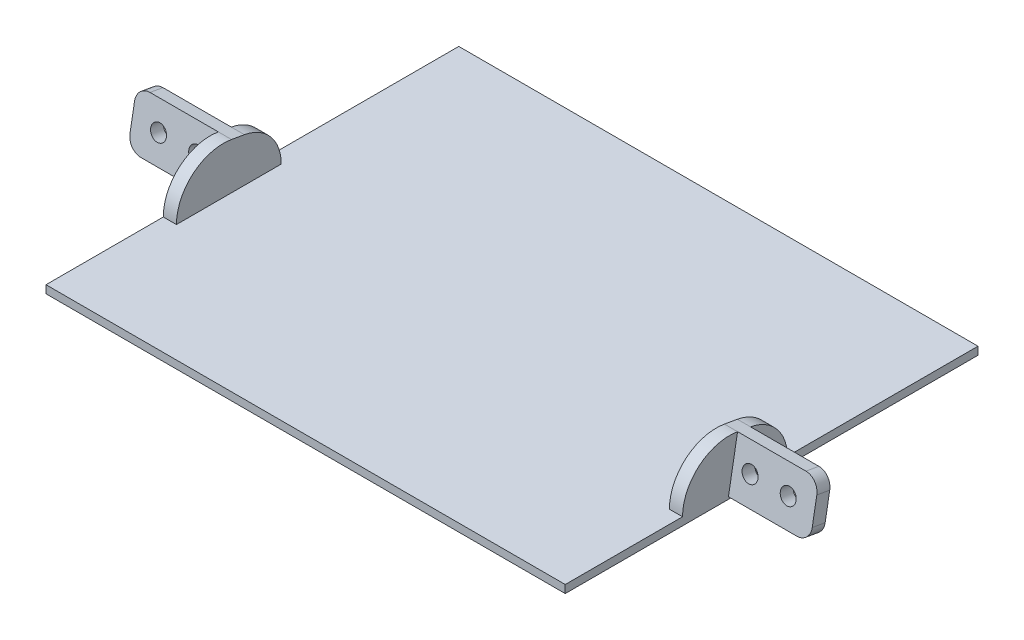
ISO-10303-21;
HEADER;
FILE_DESCRIPTION(('STEP AP214'),'2;1');
FILE_NAME('part.step','',(''),(''),'','','');
FILE_SCHEMA(('AUTOMOTIVE_DESIGN { 1 0 10303 214 1 1 1 1 }'));
ENDSEC;
DATA;
#1=APPLICATION_CONTEXT('core data for automotive mechanical design processes');
#2=APPLICATION_PROTOCOL_DEFINITION('international standard','automotive_design',2000,#1);
#3=PRODUCT_CONTEXT('',#1,'mechanical');
#4=PRODUCT('Part','Part','',(#3));
#5=PRODUCT_RELATED_PRODUCT_CATEGORY('part','',(#4));
#6=PRODUCT_DEFINITION_FORMATION('','',#4);
#7=PRODUCT_DEFINITION_CONTEXT('part definition',#1,'design');
#8=PRODUCT_DEFINITION('design','',#6,#7);
#9=PRODUCT_DEFINITION_SHAPE('','',#8);
#10=(LENGTH_UNIT() NAMED_UNIT(*) SI_UNIT(.MILLI.,.METRE.));
#11=(NAMED_UNIT(*) PLANE_ANGLE_UNIT() SI_UNIT($,.RADIAN.));
#12=(NAMED_UNIT(*) SI_UNIT($,.STERADIAN.) SOLID_ANGLE_UNIT());
#13=UNCERTAINTY_MEASURE_WITH_UNIT(LENGTH_MEASURE(1.E-05),#10,'distance_accuracy_value','');
#14=(GEOMETRIC_REPRESENTATION_CONTEXT(3) GLOBAL_UNCERTAINTY_ASSIGNED_CONTEXT((#13)) GLOBAL_UNIT_ASSIGNED_CONTEXT((#10,
#11,#12)) REPRESENTATION_CONTEXT('',''));
#15=CARTESIAN_POINT('',(0.,0.,0.));
#16=DIRECTION('',(0.,0.,1.));
#17=DIRECTION('',(1.,0.,0.));
#18=AXIS2_PLACEMENT_3D('',#15,#16,#17);
#19=CARTESIAN_POINT('',(-124.75,-4.05579787672639,5.79227965339569));
#20=DIRECTION('',(0.,0.173648177666931,0.984807753012208));
#21=DIRECTION('',(0.,-0.984807753012208,0.173648177666931));
#22=AXIS2_PLACEMENT_3D('',#19,#20,#21);
#23=PLANE('',#22);
#24=CARTESIAN_POINT('',(-119.75,0.868240888334654,4.92403876506104));
#25=DIRECTION('',(0.,0.173648177666931,0.984807753012208));
#26=DIRECTION('',(0.,-0.984807753012208,0.173648177666931));
#27=AXIS2_PLACEMENT_3D('',#24,#25,#26);
#28=CIRCLE('',#27,3.00000000000001);
#29=CARTESIAN_POINT('',(-119.75,-2.08618237070198,5.44498329806183));
#30=VERTEX_POINT('',#29);
#31=EDGE_CURVE('E342',#30,#30,#28,.T.);
#32=ORIENTED_EDGE('',*,*,#31,.F.);
#33=EDGE_LOOP('',(#32));
#34=FACE_BOUND('',#33,.T.);
#35=CARTESIAN_POINT('',(-105.25,0.868240888334654,4.92403876506104));
#36=DIRECTION('',(0.,0.173648177666931,0.984807753012208));
#37=DIRECTION('',(0.,-0.984807753012208,0.173648177666931));
#38=AXIS2_PLACEMENT_3D('',#35,#36,#37);
#39=CIRCLE('',#38,3.00000000000001);
#40=CARTESIAN_POINT('',(-105.25,-2.08618237070198,5.44498329806183));
#41=VERTEX_POINT('',#40);
#42=EDGE_CURVE('E336',#41,#41,#39,.T.);
#43=ORIENTED_EDGE('',*,*,#42,.F.);
#44=EDGE_LOOP('',(#43));
#45=FACE_BOUND('',#44,.T.);
#46=DIRECTION('',(0.,0.984807753012208,-0.173648177666931));
#47=VECTOR('',#46,1.);
#48=CARTESIAN_POINT('',(-98.75,-4.05579787672639,5.79227965339569));
#49=LINE('',#48,#47);
#50=CARTESIAN_POINT('',(-98.75,-8.97983664178743,6.66052054173035));
#51=VERTEX_POINT('',#50);
#52=CARTESIAN_POINT('',(-98.75,10.7163184184567,3.18755698839173));
#53=VERTEX_POINT('',#52);
#54=EDGE_CURVE('E49',#51,#53,#49,.T.);
#55=ORIENTED_EDGE('',*,*,#54,.T.);
#56=DIRECTION('',(-1.,0.,0.));
#57=VECTOR('',#56,1.);
#58=CARTESIAN_POINT('',(-124.75,10.7163184184567,3.18755698839173));
#59=LINE('',#58,#57);
#60=CARTESIAN_POINT('',(-124.75,10.7163184184567,3.18755698839173));
#61=VERTEX_POINT('',#60);
#62=EDGE_CURVE('E352',#53,#61,#59,.T.);
#63=ORIENTED_EDGE('',*,*,#62,.T.);
#64=CARTESIAN_POINT('',(-124.75,5.79227965339569,4.05579787672639));
#65=DIRECTION('',(0.,0.173648177666931,0.984807753012208));
#66=DIRECTION('',(0.,-0.984807753012208,0.173648177666931));
#67=AXIS2_PLACEMENT_3D('',#64,#65,#66);
#68=CIRCLE('',#67,5.);
#69=CARTESIAN_POINT('',(-129.75,5.79227965339566,4.05579787672639));
#70=VERTEX_POINT('',#69);
#71=EDGE_CURVE('E351',#61,#70,#68,.T.);
#72=ORIENTED_EDGE('',*,*,#71,.T.);
#73=DIRECTION('',(0.,-0.984807753012208,0.173648177666931));
#74=VECTOR('',#73,1.);
#75=CARTESIAN_POINT('',(-129.75,5.79227965339566,4.05579787672639));
#76=LINE('',#75,#74);
#77=CARTESIAN_POINT('',(-129.75,-4.05579787672635,5.79227965339569));
#78=VERTEX_POINT('',#77);
#79=EDGE_CURVE('E354',#70,#78,#76,.T.);
#80=ORIENTED_EDGE('',*,*,#79,.T.);
#81=CARTESIAN_POINT('',(-124.75,-4.05579787672639,5.79227965339569));
#82=DIRECTION('',(0.,0.173648177666931,0.984807753012208));
#83=DIRECTION('',(0.,-0.984807753012208,0.173648177666931));
#84=AXIS2_PLACEMENT_3D('',#81,#82,#83);
#85=CIRCLE('',#84,5.);
#86=CARTESIAN_POINT('',(-124.75,-8.97983664178743,6.66052054173035));
#87=VERTEX_POINT('',#86);
#88=EDGE_CURVE('E356',#78,#87,#85,.T.);
#89=ORIENTED_EDGE('',*,*,#88,.T.);
#90=DIRECTION('',(1.,0.,0.));
#91=VECTOR('',#90,1.);
#92=CARTESIAN_POINT('',(-124.75,-8.97983664178743,6.66052054173035));
#93=LINE('',#92,#91);
#94=EDGE_CURVE('E358',#87,#51,#93,.T.);
#95=ORIENTED_EDGE('',*,*,#94,.T.);
#96=EDGE_LOOP('',(#55,#63,#72,#80,#89,#95));
#97=FACE_BOUND('',#96,.T.);
#98=ADVANCED_FACE('F34',(#34,#45,#97),#23,.T.);
#99=CARTESIAN_POINT('',(-124.75,-8.97983664178743,6.66052054173035));
#100=DIRECTION('',(0.,0.984807753012208,-0.173648177666931));
#101=DIRECTION('',(0.,0.173648177666931,0.984807753012208));
#102=AXIS2_PLACEMENT_3D('',#99,#100,#101);
#103=PLANE('',#102);
#104=DIRECTION('',(0.,-0.173648177666931,-0.984807753012208));
#105=VECTOR('',#104,1.);
#106=CARTESIAN_POINT('',(-98.75,-8.97983664178743,6.66052054173035));
#107=LINE('',#106,#105);
#108=CARTESIAN_POINT('',(-98.75,-9.84807753012208,1.73648177666935));
#109=VERTEX_POINT('',#108);
#110=EDGE_CURVE('E42',#51,#109,#107,.T.);
#111=ORIENTED_EDGE('',*,*,#110,.F.);
#112=ORIENTED_EDGE('',*,*,#94,.F.);
#113=DIRECTION('',(0.,-0.173648177666931,-0.984807753012208));
#114=VECTOR('',#113,1.);
#115=CARTESIAN_POINT('',(-124.75,-8.97983664178743,6.66052054173035));
#116=LINE('',#115,#114);
#117=CARTESIAN_POINT('',(-124.75,-9.84807753012208,1.73648177666931));
#118=VERTEX_POINT('',#117);
#119=EDGE_CURVE('E360',#87,#118,#116,.T.);
#120=ORIENTED_EDGE('',*,*,#119,.T.);
#121=DIRECTION('',(1.,0.,0.));
#122=VECTOR('',#121,1.);
#123=CARTESIAN_POINT('',(-124.75,-9.84807753012208,1.73648177666931));
#124=LINE('',#123,#122);
#125=EDGE_CURVE('E370',#118,#109,#124,.T.);
#126=ORIENTED_EDGE('',*,*,#125,.T.);
#127=EDGE_LOOP('',(#111,#112,#120,#126));
#128=FACE_BOUND('',#127,.T.);
#129=ADVANCED_FACE('F442',(#128),#103,.F.);
#130=CARTESIAN_POINT('',(-124.75,-4.92403876506104,0.868240888334654));
#131=DIRECTION('',(0.,0.173648177666931,0.984807753012208));
#132=DIRECTION('',(0.,-0.984807753012208,0.173648177666931));
#133=AXIS2_PLACEMENT_3D('',#130,#131,#132);
#134=PLANE('',#133);
#135=DIRECTION('',(-1.,0.,0.));
#136=VECTOR('',#135,1.);
#137=CARTESIAN_POINT('',(-124.75,9.84807753012208,-1.73648177666931));
#138=LINE('',#137,#136);
#139=CARTESIAN_POINT('',(-98.75,9.84807753012208,-1.73648177666931));
#140=VERTEX_POINT('',#139);
#141=CARTESIAN_POINT('',(-124.75,9.84807753012208,-1.73648177666931));
#142=VERTEX_POINT('',#141);
#143=EDGE_CURVE('E345',#140,#142,#138,.T.);
#144=ORIENTED_EDGE('',*,*,#143,.F.);
#145=DIRECTION('',(0.,0.984807753012208,-0.173648177666931));
#146=VECTOR('',#145,1.);
#147=CARTESIAN_POINT('',(-98.75,-4.92403876506104,0.868240888334654));
#148=LINE('',#147,#146);
#149=EDGE_CURVE('E327',#109,#140,#148,.T.);
#150=ORIENTED_EDGE('',*,*,#149,.F.);
#151=ORIENTED_EDGE('',*,*,#125,.F.);
#152=CARTESIAN_POINT('',(-124.75,-4.92403876506104,0.868240888334654));
#153=DIRECTION('',(0.,0.173648177666931,0.984807753012208));
#154=DIRECTION('',(0.,-0.984807753012208,0.173648177666931));
#155=AXIS2_PLACEMENT_3D('',#152,#153,#154);
#156=CIRCLE('',#155,5.);
#157=CARTESIAN_POINT('',(-129.75,-4.92403876506101,0.868240888334647));
#158=VERTEX_POINT('',#157);
#159=EDGE_CURVE('E368',#158,#118,#156,.T.);
#160=ORIENTED_EDGE('',*,*,#159,.F.);
#161=DIRECTION('',(0.,-0.984807753012208,0.173648177666931));
#162=VECTOR('',#161,1.);
#163=CARTESIAN_POINT('',(-129.75,4.92403876506101,-0.868240888334647));
#164=LINE('',#163,#162);
#165=CARTESIAN_POINT('',(-129.75,4.92403876506101,-0.868240888334647));
#166=VERTEX_POINT('',#165);
#167=EDGE_CURVE('E366',#166,#158,#164,.T.);
#168=ORIENTED_EDGE('',*,*,#167,.F.);
#169=CARTESIAN_POINT('',(-124.75,4.92403876506104,-0.868240888334654));
#170=DIRECTION('',(0.,0.173648177666931,0.984807753012208));
#171=DIRECTION('',(0.,-0.984807753012208,0.173648177666931));
#172=AXIS2_PLACEMENT_3D('',#169,#170,#171);
#173=CIRCLE('',#172,5.);
#174=EDGE_CURVE('E364',#142,#166,#173,.T.);
#175=ORIENTED_EDGE('',*,*,#174,.F.);
#176=EDGE_LOOP('',(#144,#150,#151,#160,#168,#175));
#177=FACE_BOUND('',#176,.T.);
#178=CARTESIAN_POINT('',(-119.75,0.,0.));
#179=DIRECTION('',(0.,0.173648177666931,0.984807753012208));
#180=DIRECTION('',(0.,-0.984807753012208,0.173648177666931));
#181=AXIS2_PLACEMENT_3D('',#178,#179,#180);
#182=CIRCLE('',#181,3.00000000000001);
#183=CARTESIAN_POINT('',(-119.75,-2.95442325903663,0.520944533000794));
#184=VERTEX_POINT('',#183);
#185=EDGE_CURVE('E339',#184,#184,#182,.T.);
#186=ORIENTED_EDGE('',*,*,#185,.T.);
#187=EDGE_LOOP('',(#186));
#188=FACE_BOUND('',#187,.T.);
#189=CARTESIAN_POINT('',(-105.25,0.,0.));
#190=DIRECTION('',(0.,0.173648177666931,0.984807753012208));
#191=DIRECTION('',(0.,-0.984807753012208,0.173648177666931));
#192=AXIS2_PLACEMENT_3D('',#189,#190,#191);
#193=CIRCLE('',#192,3.00000000000001);
#194=CARTESIAN_POINT('',(-105.25,-2.95442325903663,0.520944533000794));
#195=VERTEX_POINT('',#194);
#196=EDGE_CURVE('E335',#195,#195,#193,.T.);
#197=ORIENTED_EDGE('',*,*,#196,.T.);
#198=EDGE_LOOP('',(#197));
#199=FACE_BOUND('',#198,.T.);
#200=ADVANCED_FACE('F425',(#177,#188,#199),#134,.F.);
#201=CARTESIAN_POINT('',(-93.75,10.7163184184567,3.18755698839173));
#202=DIRECTION('',(-1.,0.,0.));
#203=DIRECTION('',(0.,0.,1.));
#204=AXIS2_PLACEMENT_3D('',#201,#202,#203);
#205=PLANE('',#204);
#206=DIRECTION('',(0.,-0.173648177666931,-0.984807753012208));
#207=VECTOR('',#206,1.);
#208=CARTESIAN_POINT('',(-93.75,10.7163184184567,3.18755698839173));
#209=LINE('',#208,#207);
#210=CARTESIAN_POINT('',(-93.75,10.7163184184567,3.18755698839173));
#211=VERTEX_POINT('',#210);
#212=CARTESIAN_POINT('',(-93.75,9.84807753012208,-1.73648177666931));
#213=VERTEX_POINT('',#212);
#214=EDGE_CURVE('E383',#211,#213,#209,.T.);
#215=ORIENTED_EDGE('',*,*,#214,.F.);
#216=CARTESIAN_POINT('',(-93.75,-6.84807753012208,6.28463389397264));
#217=DIRECTION('',(1.,0.,0.));
#218=DIRECTION('',(0.,0.,-1.));
#219=AXIS2_PLACEMENT_3D('',#216,#217,#218);
#220=CIRCLE('',#219,17.8353550678851);
#221=CARTESIAN_POINT('',(-93.75,-6.84807753012208,24.1199889618577));
#222=VERTEX_POINT('',#221);
#223=EDGE_CURVE('E302',#211,#222,#220,.T.);
#224=ORIENTED_EDGE('',*,*,#223,.T.);
#225=DIRECTION('',(0.,0.,-1.));
#226=VECTOR('',#225,1.);
#227=CARTESIAN_POINT('',(-93.75,-6.84807753012208,3.18755698839173));
#228=LINE('',#227,#226);
#229=CARTESIAN_POINT('',(-93.75,-6.84807753012208,-15.7462193297989));
#230=VERTEX_POINT('',#229);
#231=EDGE_CURVE('E11',#222,#230,#228,.T.);
#232=ORIENTED_EDGE('',*,*,#231,.T.);
#233=CARTESIAN_POINT('',(-93.75,-6.84807753012208,1.20750083454391));
#234=DIRECTION('',(1.,0.,0.));
#235=DIRECTION('',(0.,0.,1.));
#236=AXIS2_PLACEMENT_3D('',#233,#234,#235);
#237=CIRCLE('',#236,16.9537201643428);
#238=EDGE_CURVE('E193',#230,#213,#237,.T.);
#239=ORIENTED_EDGE('',*,*,#238,.T.);
#240=EDGE_LOOP('',(#215,#224,#232,#239));
#241=FACE_BOUND('',#240,.T.);
#242=ADVANCED_FACE('F36',(#241),#205,.F.);
#243=CARTESIAN_POINT('',(-124.75,10.7163184184567,3.18755698839173));
#244=DIRECTION('',(0.,-0.984807753012208,0.173648177666931));
#245=DIRECTION('',(0.,-0.173648177666931,-0.984807753012208));
#246=AXIS2_PLACEMENT_3D('',#243,#244,#245);
#247=PLANE('',#246);
#248=EDGE_CURVE('E361',#213,#140,#138,.T.);
#249=ORIENTED_EDGE('',*,*,#248,.T.);
#250=ORIENTED_EDGE('',*,*,#143,.T.);
#251=DIRECTION('',(0.,-0.173648177666931,-0.984807753012208));
#252=VECTOR('',#251,1.);
#253=CARTESIAN_POINT('',(-124.75,10.7163184184567,3.18755698839173));
#254=LINE('',#253,#252);
#255=EDGE_CURVE('E380',#61,#142,#254,.T.);
#256=ORIENTED_EDGE('',*,*,#255,.F.);
#257=ORIENTED_EDGE('',*,*,#62,.F.);
#258=EDGE_CURVE('E348',#211,#53,#59,.T.);
#259=ORIENTED_EDGE('',*,*,#258,.F.);
#260=ORIENTED_EDGE('',*,*,#214,.T.);
#261=EDGE_LOOP('',(#249,#250,#256,#257,#259,#260));
#262=FACE_BOUND('',#261,.T.);
#263=ADVANCED_FACE('F415',(#262),#247,.F.);
#264=CARTESIAN_POINT('',(-124.75,5.79227965339569,4.05579787672639));
#265=DIRECTION('',(0.,-0.173648177666931,-0.984807753012208));
#266=DIRECTION('',(0.,0.984807753012208,-0.173648177666931));
#267=AXIS2_PLACEMENT_3D('',#264,#265,#266);
#268=CYLINDRICAL_SURFACE('',#267,5.);
#269=ORIENTED_EDGE('',*,*,#174,.T.);
#270=DIRECTION('',(0.,-0.173648177666931,-0.984807753012208));
#271=VECTOR('',#270,1.);
#272=CARTESIAN_POINT('',(-129.75,5.79227965339566,4.05579787672639));
#273=LINE('',#272,#271);
#274=EDGE_CURVE('E377',#70,#166,#273,.T.);
#275=ORIENTED_EDGE('',*,*,#274,.F.);
#276=ORIENTED_EDGE('',*,*,#71,.F.);
#277=ORIENTED_EDGE('',*,*,#255,.T.);
#278=EDGE_LOOP('',(#269,#275,#276,#277));
#279=FACE_BOUND('',#278,.T.);
#280=ADVANCED_FACE('F431',(#279),#268,.T.);
#281=CARTESIAN_POINT('',(-129.75,5.79227965339566,4.05579787672639));
#282=DIRECTION('',(1.,0.,0.));
#283=DIRECTION('',(0.,0.,-1.));
#284=AXIS2_PLACEMENT_3D('',#281,#282,#283);
#285=PLANE('',#284);
#286=ORIENTED_EDGE('',*,*,#167,.T.);
#287=DIRECTION('',(0.,-0.173648177666931,-0.984807753012208));
#288=VECTOR('',#287,1.);
#289=CARTESIAN_POINT('',(-129.75,-4.05579787672635,5.79227965339569));
#290=LINE('',#289,#288);
#291=EDGE_CURVE('E374',#78,#158,#290,.T.);
#292=ORIENTED_EDGE('',*,*,#291,.F.);
#293=ORIENTED_EDGE('',*,*,#79,.F.);
#294=ORIENTED_EDGE('',*,*,#274,.T.);
#295=EDGE_LOOP('',(#286,#292,#293,#294));
#296=FACE_BOUND('',#295,.T.);
#297=ADVANCED_FACE('F438',(#296),#285,.F.);
#298=CARTESIAN_POINT('',(-124.75,-4.05579787672639,5.79227965339569));
#299=DIRECTION('',(0.,-0.173648177666931,-0.984807753012208));
#300=DIRECTION('',(0.,0.984807753012208,-0.173648177666931));
#301=AXIS2_PLACEMENT_3D('',#298,#299,#300);
#302=CYLINDRICAL_SURFACE('',#301,5.);
#303=ORIENTED_EDGE('',*,*,#159,.T.);
#304=ORIENTED_EDGE('',*,*,#119,.F.);
#305=ORIENTED_EDGE('',*,*,#88,.F.);
#306=ORIENTED_EDGE('',*,*,#291,.T.);
#307=EDGE_LOOP('',(#303,#304,#305,#306));
#308=FACE_BOUND('',#307,.T.);
#309=ADVANCED_FACE('F441',(#308),#302,.T.);
#310=CARTESIAN_POINT('',(-119.75,0.868240888334654,4.92403876506104));
#311=DIRECTION('',(0.,-0.173648177666931,-0.984807753012208));
#312=DIRECTION('',(0.,0.984807753012208,-0.173648177666931));
#313=AXIS2_PLACEMENT_3D('',#310,#311,#312);
#314=CYLINDRICAL_SURFACE('',#313,3.00000000000001);
#315=ORIENTED_EDGE('',*,*,#31,.T.);
#316=EDGE_LOOP('',(#315));
#317=FACE_BOUND('',#316,.T.);
#318=ORIENTED_EDGE('',*,*,#185,.F.);
#319=EDGE_LOOP('',(#318));
#320=FACE_BOUND('',#319,.T.);
#321=ADVANCED_FACE('F456',(#317,#320),#314,.F.);
#322=CARTESIAN_POINT('',(-105.25,0.868240888334654,4.92403876506104));
#323=DIRECTION('',(0.,-0.173648177666931,-0.984807753012208));
#324=DIRECTION('',(0.,0.984807753012208,-0.173648177666931));
#325=AXIS2_PLACEMENT_3D('',#322,#323,#324);
#326=CYLINDRICAL_SURFACE('',#325,3.00000000000001);
#327=ORIENTED_EDGE('',*,*,#42,.T.);
#328=EDGE_LOOP('',(#327));
#329=FACE_BOUND('',#328,.T.);
#330=ORIENTED_EDGE('',*,*,#196,.F.);
#331=EDGE_LOOP('',(#330));
#332=FACE_BOUND('',#331,.T.);
#333=ADVANCED_FACE('F519',(#329,#332),#326,.F.);
#334=CARTESIAN_POINT('',(-98.75,0.,0.));
#335=DIRECTION('',(1.,0.,0.));
#336=DIRECTION('',(0.,0.,-1.));
#337=AXIS2_PLACEMENT_3D('',#334,#335,#336);
#338=PLANE('',#337);
#339=DIRECTION('',(0.,0.,-1.));
#340=VECTOR('',#339,1.);
#341=CARTESIAN_POINT('',(-98.75,-9.84807753012208,68.7364817766693));
#342=LINE('',#341,#340);
#343=CARTESIAN_POINT('',(-98.75,-9.84807753012208,-88.2635182233307));
#344=VERTEX_POINT('',#343);
#345=EDGE_CURVE('E313',#109,#344,#342,.T.);
#346=ORIENTED_EDGE('',*,*,#345,.F.);
#347=ORIENTED_EDGE('',*,*,#149,.T.);
#348=CARTESIAN_POINT('',(-98.75,-6.84807753012208,1.20750083454391));
#349=DIRECTION('',(1.,0.,0.));
#350=DIRECTION('',(0.,0.,1.));
#351=AXIS2_PLACEMENT_3D('',#348,#349,#350);
#352=CIRCLE('',#351,16.9537201643428);
#353=CARTESIAN_POINT('',(-98.75,-6.84807753012208,-15.7462193297989));
#354=VERTEX_POINT('',#353);
#355=EDGE_CURVE('E295',#354,#140,#352,.T.);
#356=ORIENTED_EDGE('',*,*,#355,.F.);
#357=DIRECTION('',(0.,0.,1.));
#358=VECTOR('',#357,1.);
#359=CARTESIAN_POINT('',(-98.75,-6.84807753012208,68.7364817766693));
#360=LINE('',#359,#358);
#361=CARTESIAN_POINT('',(-98.75,-6.84807753012208,-88.2635182233307));
#362=VERTEX_POINT('',#361);
#363=EDGE_CURVE('E321',#362,#354,#360,.T.);
#364=ORIENTED_EDGE('',*,*,#363,.F.);
#365=DIRECTION('',(0.,1.,0.));
#366=VECTOR('',#365,1.);
#367=CARTESIAN_POINT('',(-98.75,-6.84807753012208,-88.2635182233307));
#368=LINE('',#367,#366);
#369=EDGE_CURVE('E317',#344,#362,#368,.T.);
#370=ORIENTED_EDGE('',*,*,#369,.F.);
#371=EDGE_LOOP('',(#346,#347,#356,#364,#370));
#372=FACE_BOUND('',#371,.T.);
#373=ADVANCED_FACE('F396',(#372),#338,.F.);
#374=CARTESIAN_POINT('',(-98.75,-6.84807753012208,68.7364817766693));
#375=DIRECTION('',(0.,0.,1.));
#376=DIRECTION('',(1.,0.,0.));
#377=AXIS2_PLACEMENT_3D('',#374,#375,#376);
#378=PLANE('',#377);
#379=DIRECTION('',(1.,0.,0.));
#380=VECTOR('',#379,1.);
#381=CARTESIAN_POINT('',(-98.75,-9.84807753012208,68.7364817766693));
#382=LINE('',#381,#380);
#383=CARTESIAN_POINT('',(-98.75,-9.84807753012208,68.7364817766693));
#384=VERTEX_POINT('',#383);
#385=CARTESIAN_POINT('',(98.75,-9.84807753012208,68.7364817766693));
#386=VERTEX_POINT('',#385);
#387=EDGE_CURVE('E324',#384,#386,#382,.T.);
#388=ORIENTED_EDGE('',*,*,#387,.T.);
#389=DIRECTION('',(0.,-1.,0.));
#390=VECTOR('',#389,1.);
#391=CARTESIAN_POINT('',(98.75,-6.84807753012208,68.7364817766693));
#392=LINE('',#391,#390);
#393=CARTESIAN_POINT('',(98.75,-6.84807753012208,68.7364817766693));
#394=VERTEX_POINT('',#393);
#395=EDGE_CURVE('E289',#394,#386,#392,.T.);
#396=ORIENTED_EDGE('',*,*,#395,.F.);
#397=DIRECTION('',(1.,0.,0.));
#398=VECTOR('',#397,1.);
#399=CARTESIAN_POINT('',(-98.75,-6.84807753012208,68.7364817766693));
#400=LINE('',#399,#398);
#401=CARTESIAN_POINT('',(-98.75,-6.84807753012208,68.7364817766693));
#402=VERTEX_POINT('',#401);
#403=EDGE_CURVE('E325',#402,#394,#400,.T.);
#404=ORIENTED_EDGE('',*,*,#403,.F.);
#405=DIRECTION('',(0.,-1.,0.));
#406=VECTOR('',#405,1.);
#407=CARTESIAN_POINT('',(-98.75,-6.84807753012208,68.7364817766693));
#408=LINE('',#407,#406);
#409=EDGE_CURVE('E310',#402,#384,#408,.T.);
#410=ORIENTED_EDGE('',*,*,#409,.T.);
#411=EDGE_LOOP('',(#388,#396,#404,#410));
#412=FACE_BOUND('',#411,.T.);
#413=ADVANCED_FACE('F407',(#412),#378,.T.);
#414=CARTESIAN_POINT('',(-98.75,-6.84807753012208,68.7364817766693));
#415=DIRECTION('',(0.,1.,0.));
#416=DIRECTION('',(0.,0.,1.));
#417=AXIS2_PLACEMENT_3D('',#414,#415,#416);
#418=PLANE('',#417);
#419=DIRECTION('',(1.,0.,0.));
#420=VECTOR('',#419,1.);
#421=CARTESIAN_POINT('',(-98.75,-6.84807753012208,-15.7462193297989));
#422=LINE('',#421,#420);
#423=EDGE_CURVE('E298',#354,#230,#422,.T.);
#424=ORIENTED_EDGE('',*,*,#423,.T.);
#425=ORIENTED_EDGE('',*,*,#231,.F.);
#426=DIRECTION('',(1.,0.,0.));
#427=VECTOR('',#426,1.);
#428=CARTESIAN_POINT('',(-98.75,-6.84807753012208,24.1199889618577));
#429=LINE('',#428,#427);
#430=CARTESIAN_POINT('',(-98.75,-6.84807753012208,24.1199889618577));
#431=VERTEX_POINT('',#430);
#432=EDGE_CURVE('E306',#431,#222,#429,.T.);
#433=ORIENTED_EDGE('',*,*,#432,.F.);
#434=EDGE_CURVE('E320',#431,#402,#360,.T.);
#435=ORIENTED_EDGE('',*,*,#434,.T.);
#436=ORIENTED_EDGE('',*,*,#403,.T.);
#437=DIRECTION('',(0.,0.,1.));
#438=VECTOR('',#437,1.);
#439=CARTESIAN_POINT('',(98.75,-6.84807753012208,68.7364817766693));
#440=LINE('',#439,#438);
#441=CARTESIAN_POINT('',(98.75,-6.84807753012208,24.1199889618577));
#442=VERTEX_POINT('',#441);
#443=EDGE_CURVE('E286',#442,#394,#440,.T.);
#444=ORIENTED_EDGE('',*,*,#443,.F.);
#445=DIRECTION('',(-1.,0.,0.));
#446=VECTOR('',#445,1.);
#447=CARTESIAN_POINT('',(98.75,-6.84807753012208,24.1199889618577));
#448=LINE('',#447,#446);
#449=CARTESIAN_POINT('',(93.75,-6.84807753012208,24.1199889618577));
#450=VERTEX_POINT('',#449);
#451=EDGE_CURVE('E188',#442,#450,#448,.T.);
#452=ORIENTED_EDGE('',*,*,#451,.T.);
#453=DIRECTION('',(0.,0.,-1.));
#454=VECTOR('',#453,1.);
#455=CARTESIAN_POINT('',(93.75,-6.84807753012208,3.18755698839173));
#456=LINE('',#455,#454);
#457=CARTESIAN_POINT('',(93.75,-6.84807753012208,-15.7462193297989));
#458=VERTEX_POINT('',#457);
#459=EDGE_CURVE('E267',#450,#458,#456,.T.);
#460=ORIENTED_EDGE('',*,*,#459,.T.);
#461=DIRECTION('',(-1.,0.,0.));
#462=VECTOR('',#461,1.);
#463=CARTESIAN_POINT('',(98.75,-6.84807753012208,-15.7462193297989));
#464=LINE('',#463,#462);
#465=CARTESIAN_POINT('',(98.75,-6.84807753012208,-15.7462193297989));
#466=VERTEX_POINT('',#465);
#467=EDGE_CURVE('E292',#466,#458,#464,.T.);
#468=ORIENTED_EDGE('',*,*,#467,.F.);
#469=CARTESIAN_POINT('',(98.75,-6.84807753012208,-88.2635182233307));
#470=VERTEX_POINT('',#469);
#471=EDGE_CURVE('E282',#470,#466,#440,.T.);
#472=ORIENTED_EDGE('',*,*,#471,.F.);
#473=DIRECTION('',(1.,0.,0.));
#474=VECTOR('',#473,1.);
#475=CARTESIAN_POINT('',(-98.75,-6.84807753012208,-88.2635182233307));
#476=LINE('',#475,#474);
#477=EDGE_CURVE('E328',#362,#470,#476,.T.);
#478=ORIENTED_EDGE('',*,*,#477,.F.);
#479=ORIENTED_EDGE('',*,*,#363,.T.);
#480=EDGE_LOOP('',(#424,#425,#433,#435,#436,#444,#452,#460,#468,#472,#478,#479));
#481=FACE_BOUND('',#480,.T.);
#482=ADVANCED_FACE('F409',(#481),#418,.T.);
#483=CARTESIAN_POINT('',(-98.75,-6.84807753012208,-88.2635182233307));
#484=DIRECTION('',(0.,0.,-1.));
#485=DIRECTION('',(0.,1.,0.));
#486=AXIS2_PLACEMENT_3D('',#483,#484,#485);
#487=PLANE('',#486);
#488=ORIENTED_EDGE('',*,*,#477,.T.);
#489=DIRECTION('',(0.,1.,0.));
#490=VECTOR('',#489,1.);
#491=CARTESIAN_POINT('',(98.75,-6.84807753012208,-88.2635182233307));
#492=LINE('',#491,#490);
#493=CARTESIAN_POINT('',(98.75,-9.84807753012208,-88.2635182233307));
#494=VERTEX_POINT('',#493);
#495=EDGE_CURVE('E285',#494,#470,#492,.T.);
#496=ORIENTED_EDGE('',*,*,#495,.F.);
#497=DIRECTION('',(1.,0.,0.));
#498=VECTOR('',#497,1.);
#499=CARTESIAN_POINT('',(-98.75,-9.84807753012208,-88.2635182233307));
#500=LINE('',#499,#498);
#501=EDGE_CURVE('E330',#344,#494,#500,.T.);
#502=ORIENTED_EDGE('',*,*,#501,.F.);
#503=ORIENTED_EDGE('',*,*,#369,.T.);
#504=EDGE_LOOP('',(#488,#496,#502,#503));
#505=FACE_BOUND('',#504,.T.);
#506=ADVANCED_FACE('F555',(#505),#487,.T.);
#507=CARTESIAN_POINT('',(-98.75,-9.84807753012208,68.7364817766693));
#508=DIRECTION('',(0.,-1.,0.));
#509=DIRECTION('',(0.,0.,-1.));
#510=AXIS2_PLACEMENT_3D('',#507,#508,#509);
#511=PLANE('',#510);
#512=EDGE_CURVE('E314',#384,#109,#342,.T.);
#513=ORIENTED_EDGE('',*,*,#512,.T.);
#514=ORIENTED_EDGE('',*,*,#345,.T.);
#515=ORIENTED_EDGE('',*,*,#501,.T.);
#516=DIRECTION('',(0.,0.,-1.));
#517=VECTOR('',#516,1.);
#518=CARTESIAN_POINT('',(98.75,-9.84807753012208,68.7364817766693));
#519=LINE('',#518,#517);
#520=CARTESIAN_POINT('',(98.75,-9.84807753012208,1.73648177666935));
#521=VERTEX_POINT('',#520);
#522=EDGE_CURVE('E277',#521,#494,#519,.T.);
#523=ORIENTED_EDGE('',*,*,#522,.F.);
#524=EDGE_CURVE('E194',#386,#521,#519,.T.);
#525=ORIENTED_EDGE('',*,*,#524,.F.);
#526=ORIENTED_EDGE('',*,*,#387,.F.);
#527=EDGE_LOOP('',(#513,#514,#515,#523,#525,#526));
#528=FACE_BOUND('',#527,.T.);
#529=ADVANCED_FACE('F402',(#528),#511,.T.);
#530=ORIENTED_EDGE('',*,*,#54,.F.);
#531=ORIENTED_EDGE('',*,*,#110,.T.);
#532=ORIENTED_EDGE('',*,*,#512,.F.);
#533=ORIENTED_EDGE('',*,*,#409,.F.);
#534=ORIENTED_EDGE('',*,*,#434,.F.);
#535=CARTESIAN_POINT('',(-98.75,-6.84807753012208,6.28463389397264));
#536=DIRECTION('',(1.,0.,0.));
#537=DIRECTION('',(0.,0.,-1.));
#538=AXIS2_PLACEMENT_3D('',#535,#536,#537);
#539=CIRCLE('',#538,17.8353550678851);
#540=EDGE_CURVE('E303',#53,#431,#539,.T.);
#541=ORIENTED_EDGE('',*,*,#540,.F.);
#542=EDGE_LOOP('',(#530,#531,#532,#533,#534,#541));
#543=FACE_BOUND('',#542,.T.);
#544=ADVANCED_FACE('F389',(#543),#338,.F.);
#545=CARTESIAN_POINT('',(-98.75,-6.84807753012208,6.28463389397264));
#546=DIRECTION('',(1.,0.,0.));
#547=DIRECTION('',(0.,0.,-1.));
#548=AXIS2_PLACEMENT_3D('',#545,#546,#547);
#549=CYLINDRICAL_SURFACE('',#548,17.8353550678851);
#550=ORIENTED_EDGE('',*,*,#223,.F.);
#551=ORIENTED_EDGE('',*,*,#258,.T.);
#552=ORIENTED_EDGE('',*,*,#540,.T.);
#553=ORIENTED_EDGE('',*,*,#432,.T.);
#554=EDGE_LOOP('',(#550,#551,#552,#553));
#555=FACE_BOUND('',#554,.T.);
#556=ADVANCED_FACE('F412',(#555),#549,.T.);
#557=CARTESIAN_POINT('',(-98.75,-6.84807753012208,1.20750083454391));
#558=DIRECTION('',(1.,0.,0.));
#559=DIRECTION('',(0.,0.,-1.));
#560=AXIS2_PLACEMENT_3D('',#557,#558,#559);
#561=CYLINDRICAL_SURFACE('',#560,16.9537201643428);
#562=ORIENTED_EDGE('',*,*,#238,.F.);
#563=ORIENTED_EDGE('',*,*,#423,.F.);
#564=ORIENTED_EDGE('',*,*,#355,.T.);
#565=ORIENTED_EDGE('',*,*,#248,.F.);
#566=EDGE_LOOP('',(#562,#563,#564,#565));
#567=FACE_BOUND('',#566,.T.);
#568=ADVANCED_FACE('F420',(#567),#561,.T.);
#569=CARTESIAN_POINT('',(124.75,-4.05579787672639,5.79227965339569));
#570=DIRECTION('',(0.,0.173648177666931,0.984807753012208));
#571=DIRECTION('',(0.,-0.984807753012208,0.173648177666931));
#572=AXIS2_PLACEMENT_3D('',#569,#570,#571);
#573=PLANE('',#572);
#574=CARTESIAN_POINT('',(119.75,0.868240888334654,4.92403876506104));
#575=DIRECTION('',(0.,-0.173648177666931,-0.984807753012208));
#576=DIRECTION('',(0.,-0.984807753012208,0.173648177666931));
#577=AXIS2_PLACEMENT_3D('',#574,#575,#576);
#578=CIRCLE('',#577,3.00000000000001);
#579=CARTESIAN_POINT('',(119.75,-2.08618237070198,5.44498329806183));
#580=VERTEX_POINT('',#579);
#581=EDGE_CURVE('E223',#580,#580,#578,.T.);
#582=ORIENTED_EDGE('',*,*,#581,.T.);
#583=EDGE_LOOP('',(#582));
#584=FACE_BOUND('',#583,.T.);
#585=CARTESIAN_POINT('',(105.25,0.868240888334654,4.92403876506104));
#586=DIRECTION('',(0.,-0.173648177666931,-0.984807753012208));
#587=DIRECTION('',(0.,-0.984807753012208,0.173648177666931));
#588=AXIS2_PLACEMENT_3D('',#585,#586,#587);
#589=CIRCLE('',#588,3.00000000000001);
#590=CARTESIAN_POINT('',(105.25,-2.08618237070198,5.44498329806183));
#591=VERTEX_POINT('',#590);
#592=EDGE_CURVE('E220',#591,#591,#589,.T.);
#593=ORIENTED_EDGE('',*,*,#592,.T.);
#594=EDGE_LOOP('',(#593));
#595=FACE_BOUND('',#594,.T.);
#596=DIRECTION('',(0.,0.984807753012208,-0.173648177666931));
#597=VECTOR('',#596,1.);
#598=CARTESIAN_POINT('',(98.75,-4.05579787672639,5.79227965339569));
#599=LINE('',#598,#597);
#600=CARTESIAN_POINT('',(98.75,-8.97983664178743,6.66052054173035));
#601=VERTEX_POINT('',#600);
#602=CARTESIAN_POINT('',(98.75,10.7163184184567,3.18755698839173));
#603=VERTEX_POINT('',#602);
#604=EDGE_CURVE('E212',#601,#603,#599,.T.);
#605=ORIENTED_EDGE('',*,*,#604,.F.);
#606=DIRECTION('',(-1.,0.,0.));
#607=VECTOR('',#606,1.);
#608=CARTESIAN_POINT('',(124.75,-8.97983664178743,6.66052054173035));
#609=LINE('',#608,#607);
#610=CARTESIAN_POINT('',(124.75,-8.97983664178743,6.66052054173035));
#611=VERTEX_POINT('',#610);
#612=EDGE_CURVE('E234',#611,#601,#609,.T.);
#613=ORIENTED_EDGE('',*,*,#612,.F.);
#614=CARTESIAN_POINT('',(124.75,-4.05579787672639,5.79227965339569));
#615=DIRECTION('',(0.,-0.173648177666931,-0.984807753012208));
#616=DIRECTION('',(0.,-0.984807753012208,0.173648177666931));
#617=AXIS2_PLACEMENT_3D('',#614,#615,#616);
#618=CIRCLE('',#617,5.);
#619=CARTESIAN_POINT('',(129.75,-4.05579787672635,5.79227965339569));
#620=VERTEX_POINT('',#619);
#621=EDGE_CURVE('E231',#620,#611,#618,.T.);
#622=ORIENTED_EDGE('',*,*,#621,.F.);
#623=DIRECTION('',(0.,-0.984807753012208,0.173648177666931));
#624=VECTOR('',#623,1.);
#625=CARTESIAN_POINT('',(129.75,5.79227965339566,4.05579787672639));
#626=LINE('',#625,#624);
#627=CARTESIAN_POINT('',(129.75,5.79227965339566,4.05579787672639));
#628=VERTEX_POINT('',#627);
#629=EDGE_CURVE('E228',#628,#620,#626,.T.);
#630=ORIENTED_EDGE('',*,*,#629,.F.);
#631=CARTESIAN_POINT('',(124.75,5.79227965339569,4.05579787672639));
#632=DIRECTION('',(0.,-0.173648177666931,-0.984807753012208));
#633=DIRECTION('',(0.,-0.984807753012208,0.173648177666931));
#634=AXIS2_PLACEMENT_3D('',#631,#632,#633);
#635=CIRCLE('',#634,5.);
#636=CARTESIAN_POINT('',(124.75,10.7163184184567,3.18755698839173));
#637=VERTEX_POINT('',#636);
#638=EDGE_CURVE('E215',#637,#628,#635,.T.);
#639=ORIENTED_EDGE('',*,*,#638,.F.);
#640=DIRECTION('',(1.,0.,0.));
#641=VECTOR('',#640,1.);
#642=CARTESIAN_POINT('',(124.75,10.7163184184567,3.18755698839173));
#643=LINE('',#642,#641);
#644=EDGE_CURVE('E201',#603,#637,#643,.T.);
#645=ORIENTED_EDGE('',*,*,#644,.F.);
#646=EDGE_LOOP('',(#605,#613,#622,#630,#639,#645));
#647=FACE_BOUND('',#646,.T.);
#648=ADVANCED_FACE('F210',(#584,#595,#647),#573,.T.);
#649=CARTESIAN_POINT('',(124.75,-8.97983664178743,6.66052054173035));
#650=DIRECTION('',(0.,0.984807753012208,-0.173648177666931));
#651=DIRECTION('',(0.,0.173648177666931,0.984807753012208));
#652=AXIS2_PLACEMENT_3D('',#649,#650,#651);
#653=PLANE('',#652);
#654=DIRECTION('',(0.,-0.173648177666931,-0.984807753012208));
#655=VECTOR('',#654,1.);
#656=CARTESIAN_POINT('',(98.75,-8.97983664178743,6.66052054173035));
#657=LINE('',#656,#655);
#658=EDGE_CURVE('E218',#601,#521,#657,.T.);
#659=ORIENTED_EDGE('',*,*,#658,.T.);
#660=DIRECTION('',(-1.,0.,0.));
#661=VECTOR('',#660,1.);
#662=CARTESIAN_POINT('',(124.75,-9.84807753012208,1.73648177666931));
#663=LINE('',#662,#661);
#664=CARTESIAN_POINT('',(124.75,-9.84807753012208,1.73648177666931));
#665=VERTEX_POINT('',#664);
#666=EDGE_CURVE('E240',#665,#521,#663,.T.);
#667=ORIENTED_EDGE('',*,*,#666,.F.);
#668=DIRECTION('',(0.,-0.173648177666931,-0.984807753012208));
#669=VECTOR('',#668,1.);
#670=CARTESIAN_POINT('',(124.75,-8.97983664178743,6.66052054173035));
#671=LINE('',#670,#669);
#672=EDGE_CURVE('E237',#611,#665,#671,.T.);
#673=ORIENTED_EDGE('',*,*,#672,.F.);
#674=ORIENTED_EDGE('',*,*,#612,.T.);
#675=EDGE_LOOP('',(#659,#667,#673,#674));
#676=FACE_BOUND('',#675,.T.);
#677=ADVANCED_FACE('F599',(#676),#653,.F.);
#678=CARTESIAN_POINT('',(124.75,-4.92403876506104,0.868240888334654));
#679=DIRECTION('',(0.,0.173648177666931,0.984807753012208));
#680=DIRECTION('',(0.,-0.984807753012208,0.173648177666931));
#681=AXIS2_PLACEMENT_3D('',#678,#679,#680);
#682=PLANE('',#681);
#683=DIRECTION('',(1.,0.,0.));
#684=VECTOR('',#683,1.);
#685=CARTESIAN_POINT('',(124.75,9.84807753012208,-1.73648177666931));
#686=LINE('',#685,#684);
#687=CARTESIAN_POINT('',(98.75,9.84807753012208,-1.73648177666931));
#688=VERTEX_POINT('',#687);
#689=CARTESIAN_POINT('',(124.75,9.84807753012208,-1.73648177666931));
#690=VERTEX_POINT('',#689);
#691=EDGE_CURVE('E243',#688,#690,#686,.T.);
#692=ORIENTED_EDGE('',*,*,#691,.T.);
#693=CARTESIAN_POINT('',(124.75,4.92403876506104,-0.868240888334654));
#694=DIRECTION('',(0.,-0.173648177666931,-0.984807753012208));
#695=DIRECTION('',(0.,-0.984807753012208,0.173648177666931));
#696=AXIS2_PLACEMENT_3D('',#693,#694,#695);
#697=CIRCLE('',#696,5.);
#698=CARTESIAN_POINT('',(129.75,4.92403876506101,-0.868240888334647));
#699=VERTEX_POINT('',#698);
#700=EDGE_CURVE('E255',#690,#699,#697,.T.);
#701=ORIENTED_EDGE('',*,*,#700,.T.);
#702=DIRECTION('',(0.,-0.984807753012208,0.173648177666931));
#703=VECTOR('',#702,1.);
#704=CARTESIAN_POINT('',(129.75,4.92403876506101,-0.868240888334647));
#705=LINE('',#704,#703);
#706=CARTESIAN_POINT('',(129.75,-4.92403876506101,0.868240888334647));
#707=VERTEX_POINT('',#706);
#708=EDGE_CURVE('E252',#699,#707,#705,.T.);
#709=ORIENTED_EDGE('',*,*,#708,.T.);
#710=CARTESIAN_POINT('',(124.75,-4.92403876506104,0.868240888334654));
#711=DIRECTION('',(0.,-0.173648177666931,-0.984807753012208));
#712=DIRECTION('',(0.,-0.984807753012208,0.173648177666931));
#713=AXIS2_PLACEMENT_3D('',#710,#711,#712);
#714=CIRCLE('',#713,5.);
#715=EDGE_CURVE('E250',#707,#665,#714,.T.);
#716=ORIENTED_EDGE('',*,*,#715,.T.);
#717=ORIENTED_EDGE('',*,*,#666,.T.);
#718=DIRECTION('',(0.,0.984807753012208,-0.173648177666931));
#719=VECTOR('',#718,1.);
#720=CARTESIAN_POINT('',(98.75,-4.92403876506104,0.868240888334654));
#721=LINE('',#720,#719);
#722=EDGE_CURVE('E246',#521,#688,#721,.T.);
#723=ORIENTED_EDGE('',*,*,#722,.T.);
#724=EDGE_LOOP('',(#692,#701,#709,#716,#717,#723));
#725=FACE_BOUND('',#724,.T.);
#726=CARTESIAN_POINT('',(119.75,0.,0.));
#727=DIRECTION('',(0.,-0.173648177666931,-0.984807753012208));
#728=DIRECTION('',(0.,-0.984807753012208,0.173648177666931));
#729=AXIS2_PLACEMENT_3D('',#726,#727,#728);
#730=CIRCLE('',#729,3.00000000000001);
#731=CARTESIAN_POINT('',(119.75,-2.95442325903663,0.520944533000794));
#732=VERTEX_POINT('',#731);
#733=EDGE_CURVE('E258',#732,#732,#730,.T.);
#734=ORIENTED_EDGE('',*,*,#733,.F.);
#735=EDGE_LOOP('',(#734));
#736=FACE_BOUND('',#735,.T.);
#737=CARTESIAN_POINT('',(105.25,0.,0.));
#738=DIRECTION('',(0.,-0.173648177666931,-0.984807753012208));
#739=DIRECTION('',(0.,-0.984807753012208,0.173648177666931));
#740=AXIS2_PLACEMENT_3D('',#737,#738,#739);
#741=CIRCLE('',#740,3.00000000000001);
#742=CARTESIAN_POINT('',(105.25,-2.95442325903663,0.520944533000794));
#743=VERTEX_POINT('',#742);
#744=EDGE_CURVE('E261',#743,#743,#741,.T.);
#745=ORIENTED_EDGE('',*,*,#744,.F.);
#746=EDGE_LOOP('',(#745));
#747=FACE_BOUND('',#746,.T.);
#748=ADVANCED_FACE('F608',(#725,#736,#747),#682,.F.);
#749=CARTESIAN_POINT('',(93.75,10.7163184184567,3.18755698839173));
#750=DIRECTION('',(1.,0.,0.));
#751=DIRECTION('',(0.,0.,1.));
#752=AXIS2_PLACEMENT_3D('',#749,#750,#751);
#753=PLANE('',#752);
#754=DIRECTION('',(0.,-0.173648177666931,-0.984807753012208));
#755=VECTOR('',#754,1.);
#756=CARTESIAN_POINT('',(93.75,10.7163184184567,3.18755698839173));
#757=LINE('',#756,#755);
#758=CARTESIAN_POINT('',(93.75,10.7163184184567,3.18755698839173));
#759=VERTEX_POINT('',#758);
#760=CARTESIAN_POINT('',(93.75,9.84807753012208,-1.73648177666931));
#761=VERTEX_POINT('',#760);
#762=EDGE_CURVE('E204',#759,#761,#757,.T.);
#763=ORIENTED_EDGE('',*,*,#762,.T.);
#764=CARTESIAN_POINT('',(93.75,-6.84807753012208,1.20750083454391));
#765=DIRECTION('',(1.,0.,0.));
#766=DIRECTION('',(0.,0.,1.));
#767=AXIS2_PLACEMENT_3D('',#764,#765,#766);
#768=CIRCLE('',#767,16.9537201643428);
#769=EDGE_CURVE('E270',#458,#761,#768,.T.);
#770=ORIENTED_EDGE('',*,*,#769,.F.);
#771=ORIENTED_EDGE('',*,*,#459,.F.);
#772=CARTESIAN_POINT('',(93.75,-6.84807753012208,6.28463389397264));
#773=DIRECTION('',(1.,0.,0.));
#774=DIRECTION('',(0.,0.,-1.));
#775=AXIS2_PLACEMENT_3D('',#772,#773,#774);
#776=CIRCLE('',#775,17.8353550678851);
#777=EDGE_CURVE('E265',#759,#450,#776,.T.);
#778=ORIENTED_EDGE('',*,*,#777,.F.);
#779=EDGE_LOOP('',(#763,#770,#771,#778));
#780=FACE_BOUND('',#779,.T.);
#781=ADVANCED_FACE('F617',(#780),#753,.F.);
#782=CARTESIAN_POINT('',(124.75,10.7163184184567,3.18755698839173));
#783=DIRECTION('',(0.,-0.984807753012208,0.173648177666931));
#784=DIRECTION('',(0.,-0.173648177666931,-0.984807753012208));
#785=AXIS2_PLACEMENT_3D('',#782,#783,#784);
#786=PLANE('',#785);
#787=EDGE_CURVE('E247',#761,#688,#686,.T.);
#788=ORIENTED_EDGE('',*,*,#787,.F.);
#789=ORIENTED_EDGE('',*,*,#762,.F.);
#790=EDGE_CURVE('E186',#759,#603,#643,.T.);
#791=ORIENTED_EDGE('',*,*,#790,.T.);
#792=ORIENTED_EDGE('',*,*,#644,.T.);
#793=DIRECTION('',(0.,-0.173648177666931,-0.984807753012208));
#794=VECTOR('',#793,1.);
#795=CARTESIAN_POINT('',(124.75,10.7163184184567,3.18755698839173));
#796=LINE('',#795,#794);
#797=EDGE_CURVE('E206',#637,#690,#796,.T.);
#798=ORIENTED_EDGE('',*,*,#797,.T.);
#799=ORIENTED_EDGE('',*,*,#691,.F.);
#800=EDGE_LOOP('',(#788,#789,#791,#792,#798,#799));
#801=FACE_BOUND('',#800,.T.);
#802=ADVANCED_FACE('F200',(#801),#786,.F.);
#803=CARTESIAN_POINT('',(124.75,5.79227965339569,4.05579787672639));
#804=DIRECTION('',(0.,-0.173648177666931,-0.984807753012208));
#805=DIRECTION('',(0.,0.984807753012208,-0.173648177666931));
#806=AXIS2_PLACEMENT_3D('',#803,#804,#805);
#807=CYLINDRICAL_SURFACE('',#806,5.);
#808=ORIENTED_EDGE('',*,*,#700,.F.);
#809=ORIENTED_EDGE('',*,*,#797,.F.);
#810=ORIENTED_EDGE('',*,*,#638,.T.);
#811=DIRECTION('',(0.,-0.173648177666931,-0.984807753012208));
#812=VECTOR('',#811,1.);
#813=CARTESIAN_POINT('',(129.75,5.79227965339566,4.05579787672639));
#814=LINE('',#813,#812);
#815=EDGE_CURVE('E205',#628,#699,#814,.T.);
#816=ORIENTED_EDGE('',*,*,#815,.T.);
#817=EDGE_LOOP('',(#808,#809,#810,#816));
#818=FACE_BOUND('',#817,.T.);
#819=ADVANCED_FACE('F639',(#818),#807,.T.);
#820=CARTESIAN_POINT('',(129.75,5.79227965339566,4.05579787672639));
#821=DIRECTION('',(-1.,0.,0.));
#822=DIRECTION('',(0.,0.,-1.));
#823=AXIS2_PLACEMENT_3D('',#820,#821,#822);
#824=PLANE('',#823);
#825=ORIENTED_EDGE('',*,*,#708,.F.);
#826=ORIENTED_EDGE('',*,*,#815,.F.);
#827=ORIENTED_EDGE('',*,*,#629,.T.);
#828=DIRECTION('',(0.,-0.173648177666931,-0.984807753012208));
#829=VECTOR('',#828,1.);
#830=CARTESIAN_POINT('',(129.75,-4.05579787672635,5.79227965339569));
#831=LINE('',#830,#829);
#832=EDGE_CURVE('E275',#620,#707,#831,.T.);
#833=ORIENTED_EDGE('',*,*,#832,.T.);
#834=EDGE_LOOP('',(#825,#826,#827,#833));
#835=FACE_BOUND('',#834,.T.);
#836=ADVANCED_FACE('F647',(#835),#824,.F.);
#837=CARTESIAN_POINT('',(124.75,-4.05579787672639,5.79227965339569));
#838=DIRECTION('',(0.,-0.173648177666931,-0.984807753012208));
#839=DIRECTION('',(0.,0.984807753012208,-0.173648177666931));
#840=AXIS2_PLACEMENT_3D('',#837,#838,#839);
#841=CYLINDRICAL_SURFACE('',#840,5.);
#842=ORIENTED_EDGE('',*,*,#715,.F.);
#843=ORIENTED_EDGE('',*,*,#832,.F.);
#844=ORIENTED_EDGE('',*,*,#621,.T.);
#845=ORIENTED_EDGE('',*,*,#672,.T.);
#846=EDGE_LOOP('',(#842,#843,#844,#845));
#847=FACE_BOUND('',#846,.T.);
#848=ADVANCED_FACE('F656',(#847),#841,.T.);
#849=CARTESIAN_POINT('',(119.75,0.868240888334654,4.92403876506104));
#850=DIRECTION('',(0.,-0.173648177666931,-0.984807753012208));
#851=DIRECTION('',(0.,0.984807753012208,-0.173648177666931));
#852=AXIS2_PLACEMENT_3D('',#849,#850,#851);
#853=CYLINDRICAL_SURFACE('',#852,3.00000000000001);
#854=ORIENTED_EDGE('',*,*,#581,.F.);
#855=EDGE_LOOP('',(#854));
#856=FACE_BOUND('',#855,.T.);
#857=ORIENTED_EDGE('',*,*,#733,.T.);
#858=EDGE_LOOP('',(#857));
#859=FACE_BOUND('',#858,.T.);
#860=ADVANCED_FACE('F665',(#856,#859),#853,.F.);
#861=CARTESIAN_POINT('',(105.25,0.868240888334654,4.92403876506104));
#862=DIRECTION('',(0.,-0.173648177666931,-0.984807753012208));
#863=DIRECTION('',(0.,0.984807753012208,-0.173648177666931));
#864=AXIS2_PLACEMENT_3D('',#861,#862,#863);
#865=CYLINDRICAL_SURFACE('',#864,3.00000000000001);
#866=ORIENTED_EDGE('',*,*,#592,.F.);
#867=EDGE_LOOP('',(#866));
#868=FACE_BOUND('',#867,.T.);
#869=ORIENTED_EDGE('',*,*,#744,.T.);
#870=EDGE_LOOP('',(#869));
#871=FACE_BOUND('',#870,.T.);
#872=ADVANCED_FACE('F674',(#868,#871),#865,.F.);
#873=CARTESIAN_POINT('',(98.75,0.,0.));
#874=DIRECTION('',(-1.,0.,0.));
#875=DIRECTION('',(0.,0.,-1.));
#876=AXIS2_PLACEMENT_3D('',#873,#874,#875);
#877=PLANE('',#876);
#878=ORIENTED_EDGE('',*,*,#522,.T.);
#879=ORIENTED_EDGE('',*,*,#495,.T.);
#880=ORIENTED_EDGE('',*,*,#471,.T.);
#881=CARTESIAN_POINT('',(98.75,-6.84807753012208,1.20750083454391));
#882=DIRECTION('',(1.,0.,0.));
#883=DIRECTION('',(0.,0.,1.));
#884=AXIS2_PLACEMENT_3D('',#881,#882,#883);
#885=CIRCLE('',#884,16.9537201643428);
#886=EDGE_CURVE('E280',#466,#688,#885,.T.);
#887=ORIENTED_EDGE('',*,*,#886,.T.);
#888=ORIENTED_EDGE('',*,*,#722,.F.);
#889=EDGE_LOOP('',(#878,#879,#880,#887,#888));
#890=FACE_BOUND('',#889,.T.);
#891=ADVANCED_FACE('F683',(#890),#877,.F.);
#892=ORIENTED_EDGE('',*,*,#604,.T.);
#893=CARTESIAN_POINT('',(98.75,-6.84807753012208,6.28463389397264));
#894=DIRECTION('',(1.,0.,0.));
#895=DIRECTION('',(0.,0.,-1.));
#896=AXIS2_PLACEMENT_3D('',#893,#894,#895);
#897=CIRCLE('',#896,17.8353550678851);
#898=EDGE_CURVE('E182',#603,#442,#897,.T.);
#899=ORIENTED_EDGE('',*,*,#898,.T.);
#900=ORIENTED_EDGE('',*,*,#443,.T.);
#901=ORIENTED_EDGE('',*,*,#395,.T.);
#902=ORIENTED_EDGE('',*,*,#524,.T.);
#903=ORIENTED_EDGE('',*,*,#658,.F.);
#904=EDGE_LOOP('',(#892,#899,#900,#901,#902,#903));
#905=FACE_BOUND('',#904,.T.);
#906=ADVANCED_FACE('F216',(#905),#877,.F.);
#907=CARTESIAN_POINT('',(98.75,-6.84807753012208,6.28463389397264));
#908=DIRECTION('',(-1.,0.,0.));
#909=DIRECTION('',(0.,0.,-1.));
#910=AXIS2_PLACEMENT_3D('',#907,#908,#909);
#911=CYLINDRICAL_SURFACE('',#910,17.8353550678851);
#912=ORIENTED_EDGE('',*,*,#777,.T.);
#913=ORIENTED_EDGE('',*,*,#451,.F.);
#914=ORIENTED_EDGE('',*,*,#898,.F.);
#915=ORIENTED_EDGE('',*,*,#790,.F.);
#916=EDGE_LOOP('',(#912,#913,#914,#915));
#917=FACE_BOUND('',#916,.T.);
#918=ADVANCED_FACE('F185',(#917),#911,.T.);
#919=CARTESIAN_POINT('',(98.75,-6.84807753012208,1.20750083454391));
#920=DIRECTION('',(-1.,0.,0.));
#921=DIRECTION('',(0.,0.,-1.));
#922=AXIS2_PLACEMENT_3D('',#919,#920,#921);
#923=CYLINDRICAL_SURFACE('',#922,16.9537201643428);
#924=ORIENTED_EDGE('',*,*,#769,.T.);
#925=ORIENTED_EDGE('',*,*,#787,.T.);
#926=ORIENTED_EDGE('',*,*,#886,.F.);
#927=ORIENTED_EDGE('',*,*,#467,.T.);
#928=EDGE_LOOP('',(#924,#925,#926,#927));
#929=FACE_BOUND('',#928,.T.);
#930=ADVANCED_FACE('F712',(#929),#923,.T.);
#931=CLOSED_SHELL('',(#98,#129,#200,#242,#263,#280,#297,#309,#321,#333,#373,#413,#482,#506,#529,
#544,#556,#568,#648,#677,#748,#781,#802,#819,#836,#848,#860,#872,#891,#906,#918,#930));
#932=MANIFOLD_SOLID_BREP('B2',#931);
#933=ADVANCED_BREP_SHAPE_REPRESENTATION('',(#18,#932),#14);
#934=SHAPE_DEFINITION_REPRESENTATION(#9,#933);
ENDSEC;
END-ISO-10303-21;
